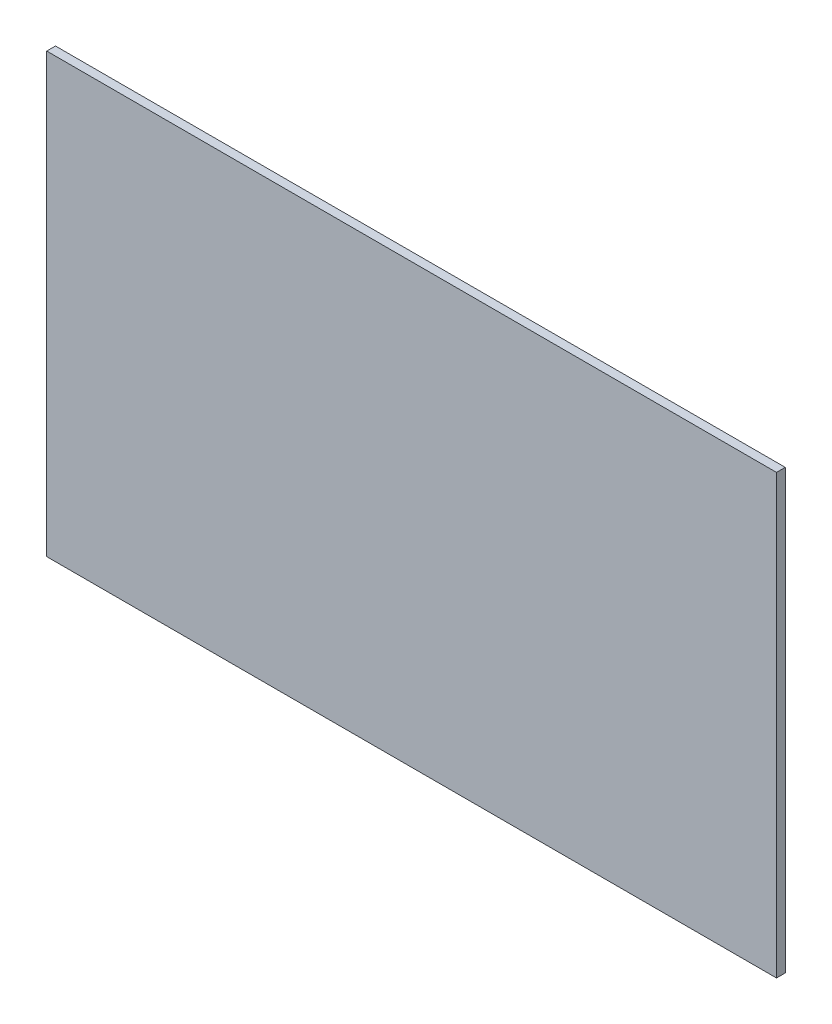
ISO-10303-21;
HEADER;
FILE_DESCRIPTION(('STEP AP214'),'2;1');
FILE_NAME('part.step','',(''),(''),'','','');
FILE_SCHEMA(('AUTOMOTIVE_DESIGN { 1 0 10303 214 1 1 1 1 }'));
ENDSEC;
DATA;
#1=APPLICATION_CONTEXT('core data for automotive mechanical design processes');
#2=APPLICATION_PROTOCOL_DEFINITION('international standard','automotive_design',2000,#1);
#3=PRODUCT_CONTEXT('',#1,'mechanical');
#4=PRODUCT('Part','Part','',(#3));
#5=PRODUCT_RELATED_PRODUCT_CATEGORY('part','',(#4));
#6=PRODUCT_DEFINITION_FORMATION('','',#4);
#7=PRODUCT_DEFINITION_CONTEXT('part definition',#1,'design');
#8=PRODUCT_DEFINITION('design','',#6,#7);
#9=PRODUCT_DEFINITION_SHAPE('','',#8);
#10=(LENGTH_UNIT() NAMED_UNIT(*) SI_UNIT(.MILLI.,.METRE.));
#11=(NAMED_UNIT(*) PLANE_ANGLE_UNIT() SI_UNIT($,.RADIAN.));
#12=(NAMED_UNIT(*) SI_UNIT($,.STERADIAN.) SOLID_ANGLE_UNIT());
#13=UNCERTAINTY_MEASURE_WITH_UNIT(LENGTH_MEASURE(1.E-05),#10,'distance_accuracy_value','');
#14=(GEOMETRIC_REPRESENTATION_CONTEXT(3) GLOBAL_UNCERTAINTY_ASSIGNED_CONTEXT((#13)) GLOBAL_UNIT_ASSIGNED_CONTEXT((#10,
#11,#12)) REPRESENTATION_CONTEXT('',''));
#15=CARTESIAN_POINT('',(0.,0.,0.));
#16=DIRECTION('',(0.,0.,1.));
#17=DIRECTION('',(1.,0.,0.));
#18=AXIS2_PLACEMENT_3D('',#15,#16,#17);
#19=CARTESIAN_POINT('',(-105.575868372943,55.3016453382084,3.));
#20=DIRECTION('',(1.,0.,0.));
#21=DIRECTION('',(0.,1.,0.));
#22=AXIS2_PLACEMENT_3D('',#19,#20,#21);
#23=PLANE('',#22);
#24=DIRECTION('',(0.,-1.,0.));
#25=VECTOR('',#24,1.);
#26=CARTESIAN_POINT('',(-105.575868372943,55.3016453382084,0.));
#27=LINE('',#26,#25);
#28=CARTESIAN_POINT('',(-105.575868372943,55.3016453382084,0.));
#29=VERTEX_POINT('',#28);
#30=CARTESIAN_POINT('',(-105.575868372943,-94.6983546617916,0.));
#31=VERTEX_POINT('',#30);
#32=EDGE_CURVE('E96',#29,#31,#27,.T.);
#33=ORIENTED_EDGE('',*,*,#32,.T.);
#34=DIRECTION('',(0.,0.,-1.));
#35=VECTOR('',#34,1.);
#36=CARTESIAN_POINT('',(-105.575868372943,-94.6983546617916,3.));
#37=LINE('',#36,#35);
#38=CARTESIAN_POINT('',(-105.575868372943,-94.6983546617916,3.));
#39=VERTEX_POINT('',#38);
#40=EDGE_CURVE('E11',#39,#31,#37,.T.);
#41=ORIENTED_EDGE('',*,*,#40,.F.);
#42=DIRECTION('',(0.,-1.,0.));
#43=VECTOR('',#42,1.);
#44=CARTESIAN_POINT('',(-105.575868372943,55.3016453382084,3.));
#45=LINE('',#44,#43);
#46=CARTESIAN_POINT('',(-105.575868372943,55.3016453382084,3.));
#47=VERTEX_POINT('',#46);
#48=EDGE_CURVE('E84',#47,#39,#45,.T.);
#49=ORIENTED_EDGE('',*,*,#48,.F.);
#50=DIRECTION('',(0.,0.,-1.));
#51=VECTOR('',#50,1.);
#52=CARTESIAN_POINT('',(-105.575868372943,55.3016453382084,3.));
#53=LINE('',#52,#51);
#54=EDGE_CURVE('E92',#47,#29,#53,.T.);
#55=ORIENTED_EDGE('',*,*,#54,.T.);
#56=EDGE_LOOP('',(#33,#41,#49,#55));
#57=FACE_BOUND('',#56,.T.);
#58=ADVANCED_FACE('F33',(#57),#23,.F.);
#59=CARTESIAN_POINT('',(-105.575868372943,-94.6983546617916,3.));
#60=DIRECTION('',(0.,1.,0.));
#61=DIRECTION('',(0.,0.,1.));
#62=AXIS2_PLACEMENT_3D('',#59,#60,#61);
#63=PLANE('',#62);
#64=DIRECTION('',(1.,0.,0.));
#65=VECTOR('',#64,1.);
#66=CARTESIAN_POINT('',(-105.575868372943,-94.6983546617916,0.));
#67=LINE('',#66,#65);
#68=CARTESIAN_POINT('',(144.424131627057,-94.6983546617916,0.));
#69=VERTEX_POINT('',#68);
#70=EDGE_CURVE('E88',#31,#69,#67,.T.);
#71=ORIENTED_EDGE('',*,*,#70,.T.);
#72=DIRECTION('',(0.,0.,-1.));
#73=VECTOR('',#72,1.);
#74=CARTESIAN_POINT('',(144.424131627057,-94.6983546617916,3.));
#75=LINE('',#74,#73);
#76=CARTESIAN_POINT('',(144.424131627057,-94.6983546617916,3.));
#77=VERTEX_POINT('',#76);
#78=EDGE_CURVE('E41',#77,#69,#75,.T.);
#79=ORIENTED_EDGE('',*,*,#78,.F.);
#80=DIRECTION('',(1.,0.,0.));
#81=VECTOR('',#80,1.);
#82=CARTESIAN_POINT('',(-105.575868372943,-94.6983546617916,3.));
#83=LINE('',#82,#81);
#84=EDGE_CURVE('E79',#39,#77,#83,.T.);
#85=ORIENTED_EDGE('',*,*,#84,.F.);
#86=ORIENTED_EDGE('',*,*,#40,.T.);
#87=EDGE_LOOP('',(#71,#79,#85,#86));
#88=FACE_BOUND('',#87,.T.);
#89=ADVANCED_FACE('F87',(#88),#63,.F.);
#90=CARTESIAN_POINT('',(144.424131627057,55.3016453382084,3.));
#91=DIRECTION('',(-1.,0.,0.));
#92=DIRECTION('',(0.,-1.,0.));
#93=AXIS2_PLACEMENT_3D('',#90,#91,#92);
#94=PLANE('',#93);
#95=DIRECTION('',(0.,1.,0.));
#96=VECTOR('',#95,1.);
#97=CARTESIAN_POINT('',(144.424131627057,55.3016453382084,0.));
#98=LINE('',#97,#96);
#99=CARTESIAN_POINT('',(144.424131627057,55.3016453382084,0.));
#100=VERTEX_POINT('',#99);
#101=EDGE_CURVE('E66',#69,#100,#98,.T.);
#102=ORIENTED_EDGE('',*,*,#101,.T.);
#103=DIRECTION('',(0.,0.,-1.));
#104=VECTOR('',#103,1.);
#105=CARTESIAN_POINT('',(144.424131627057,55.3016453382084,3.));
#106=LINE('',#105,#104);
#107=CARTESIAN_POINT('',(144.424131627057,55.3016453382084,3.));
#108=VERTEX_POINT('',#107);
#109=EDGE_CURVE('E89',#108,#100,#106,.T.);
#110=ORIENTED_EDGE('',*,*,#109,.F.);
#111=DIRECTION('',(0.,1.,0.));
#112=VECTOR('',#111,1.);
#113=CARTESIAN_POINT('',(144.424131627057,55.3016453382084,3.));
#114=LINE('',#113,#112);
#115=EDGE_CURVE('E82',#77,#108,#114,.T.);
#116=ORIENTED_EDGE('',*,*,#115,.F.);
#117=ORIENTED_EDGE('',*,*,#78,.T.);
#118=EDGE_LOOP('',(#102,#110,#116,#117));
#119=FACE_BOUND('',#118,.T.);
#120=ADVANCED_FACE('F90',(#119),#94,.F.);
#121=CARTESIAN_POINT('',(-105.575868372943,55.3016453382084,3.));
#122=DIRECTION('',(0.,-1.,0.));
#123=DIRECTION('',(0.,0.,-1.));
#124=AXIS2_PLACEMENT_3D('',#121,#122,#123);
#125=PLANE('',#124);
#126=DIRECTION('',(-1.,0.,0.));
#127=VECTOR('',#126,1.);
#128=CARTESIAN_POINT('',(-105.575868372943,55.3016453382084,0.));
#129=LINE('',#128,#127);
#130=EDGE_CURVE('E72',#100,#29,#129,.T.);
#131=ORIENTED_EDGE('',*,*,#130,.T.);
#132=ORIENTED_EDGE('',*,*,#54,.F.);
#133=DIRECTION('',(-1.,0.,0.));
#134=VECTOR('',#133,1.);
#135=CARTESIAN_POINT('',(-105.575868372943,55.3016453382084,3.));
#136=LINE('',#135,#134);
#137=EDGE_CURVE('E49',#108,#47,#136,.T.);
#138=ORIENTED_EDGE('',*,*,#137,.F.);
#139=ORIENTED_EDGE('',*,*,#109,.T.);
#140=EDGE_LOOP('',(#131,#132,#138,#139));
#141=FACE_BOUND('',#140,.T.);
#142=ADVANCED_FACE('F103',(#141),#125,.F.);
#143=CARTESIAN_POINT('',(0.,0.,3.));
#144=DIRECTION('',(0.,0.,1.));
#145=DIRECTION('',(1.,0.,0.));
#146=AXIS2_PLACEMENT_3D('',#143,#144,#145);
#147=PLANE('',#146);
#148=ORIENTED_EDGE('',*,*,#48,.T.);
#149=ORIENTED_EDGE('',*,*,#84,.T.);
#150=ORIENTED_EDGE('',*,*,#115,.T.);
#151=ORIENTED_EDGE('',*,*,#137,.T.);
#152=EDGE_LOOP('',(#148,#149,#150,#151));
#153=FACE_BOUND('',#152,.T.);
#154=ADVANCED_FACE('F80',(#153),#147,.T.);
#155=CARTESIAN_POINT('',(0.,0.,0.));
#156=DIRECTION('',(0.,0.,1.));
#157=DIRECTION('',(1.,0.,0.));
#158=AXIS2_PLACEMENT_3D('',#155,#156,#157);
#159=PLANE('',#158);
#160=ORIENTED_EDGE('',*,*,#32,.F.);
#161=ORIENTED_EDGE('',*,*,#130,.F.);
#162=ORIENTED_EDGE('',*,*,#101,.F.);
#163=ORIENTED_EDGE('',*,*,#70,.F.);
#164=EDGE_LOOP('',(#160,#161,#162,#163));
#165=FACE_BOUND('',#164,.T.);
#166=ADVANCED_FACE('F106',(#165),#159,.F.);
#167=CLOSED_SHELL('',(#58,#89,#120,#142,#154,#166));
#168=MANIFOLD_SOLID_BREP('B2',#167);
#169=ADVANCED_BREP_SHAPE_REPRESENTATION('',(#18,#168),#14);
#170=SHAPE_DEFINITION_REPRESENTATION(#9,#169);
ENDSEC;
END-ISO-10303-21;
